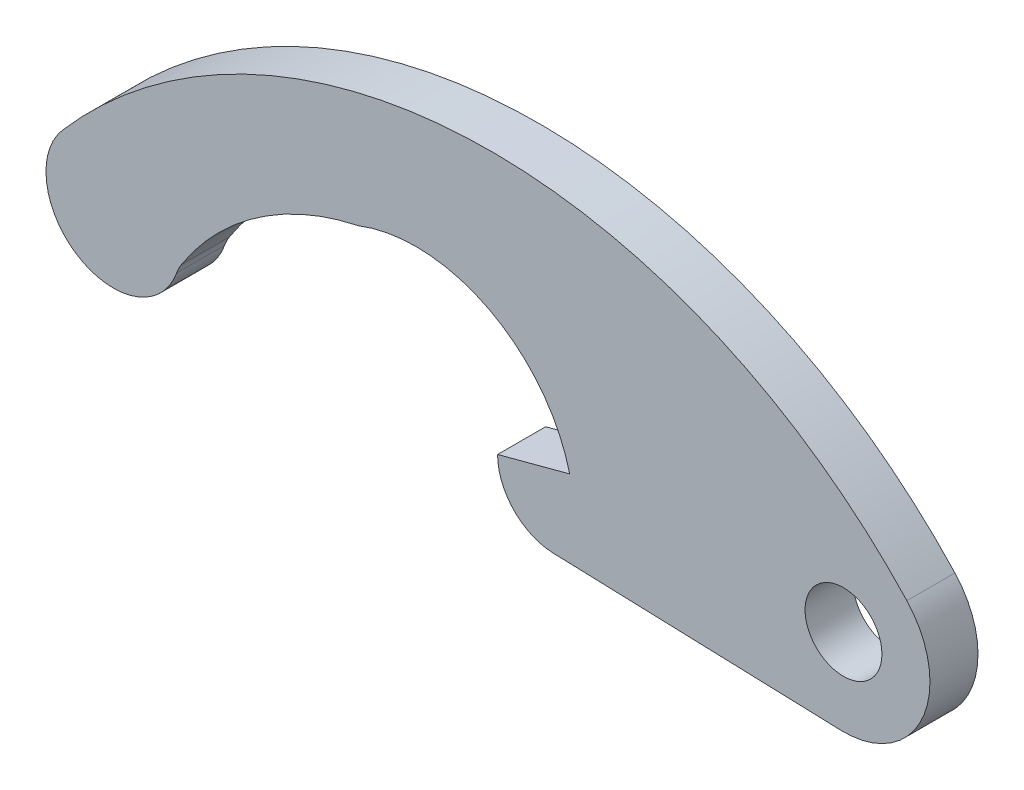
ISO-10303-21;
HEADER;
FILE_DESCRIPTION(('STEP AP214'),'2;1');
FILE_NAME('part.step','',(''),(''),'','','');
FILE_SCHEMA(('AUTOMOTIVE_DESIGN { 1 0 10303 214 1 1 1 1 }'));
ENDSEC;
DATA;
#1=APPLICATION_CONTEXT('core data for automotive mechanical design processes');
#2=APPLICATION_PROTOCOL_DEFINITION('international standard','automotive_design',2000,#1);
#3=PRODUCT_CONTEXT('',#1,'mechanical');
#4=PRODUCT('Part','Part','',(#3));
#5=PRODUCT_RELATED_PRODUCT_CATEGORY('part','',(#4));
#6=PRODUCT_DEFINITION_FORMATION('','',#4);
#7=PRODUCT_DEFINITION_CONTEXT('part definition',#1,'design');
#8=PRODUCT_DEFINITION('design','',#6,#7);
#9=PRODUCT_DEFINITION_SHAPE('','',#8);
#10=(LENGTH_UNIT() NAMED_UNIT(*) SI_UNIT(.MILLI.,.METRE.));
#11=(NAMED_UNIT(*) PLANE_ANGLE_UNIT() SI_UNIT($,.RADIAN.));
#12=(NAMED_UNIT(*) SI_UNIT($,.STERADIAN.) SOLID_ANGLE_UNIT());
#13=UNCERTAINTY_MEASURE_WITH_UNIT(LENGTH_MEASURE(1.E-05),#10,'distance_accuracy_value','');
#14=(GEOMETRIC_REPRESENTATION_CONTEXT(3) GLOBAL_UNCERTAINTY_ASSIGNED_CONTEXT((#13)) GLOBAL_UNIT_ASSIGNED_CONTEXT((#10,
#11,#12)) REPRESENTATION_CONTEXT('',''));
#15=CARTESIAN_POINT('',(0.,0.,0.));
#16=DIRECTION('',(0.,0.,1.));
#17=DIRECTION('',(1.,0.,0.));
#18=AXIS2_PLACEMENT_3D('',#15,#16,#17);
#19=CARTESIAN_POINT('',(-18.034,26.416,2.54));
#20=DIRECTION('',(0.,0.,-1.));
#21=DIRECTION('',(-1.,0.,0.));
#22=AXIS2_PLACEMENT_3D('',#19,#20,#21);
#23=CYLINDRICAL_SURFACE('',#22,3.048);
#24=CARTESIAN_POINT('',(-18.034,26.416,0.));
#25=DIRECTION('',(0.,0.,1.));
#26=DIRECTION('',(1.,0.,0.));
#27=AXIS2_PLACEMENT_3D('',#24,#25,#26);
#28=CIRCLE('',#27,3.048);
#29=CARTESIAN_POINT('',(-21.082,26.416,0.));
#30=VERTEX_POINT('',#29);
#31=CARTESIAN_POINT('',(-18.1357131720379,23.3696975805685,0.));
#32=VERTEX_POINT('',#31);
#33=EDGE_CURVE('E141',#30,#32,#28,.T.);
#34=ORIENTED_EDGE('',*,*,#33,.T.);
#35=DIRECTION('',(0.,0.,-1.));
#36=VECTOR('',#35,1.);
#37=CARTESIAN_POINT('',(-18.1357131720379,23.3696975805685,2.54));
#38=LINE('',#37,#36);
#39=CARTESIAN_POINT('',(-18.1357131720379,23.3696975805685,2.54));
#40=VERTEX_POINT('',#39);
#41=EDGE_CURVE('E11',#40,#32,#38,.T.);
#42=ORIENTED_EDGE('',*,*,#41,.F.);
#43=CARTESIAN_POINT('',(-18.034,26.416,2.54));
#44=DIRECTION('',(0.,0.,1.));
#45=DIRECTION('',(1.,0.,0.));
#46=AXIS2_PLACEMENT_3D('',#43,#44,#45);
#47=CIRCLE('',#46,3.048);
#48=CARTESIAN_POINT('',(-21.082,26.416,2.54));
#49=VERTEX_POINT('',#48);
#50=EDGE_CURVE('E158',#49,#40,#47,.T.);
#51=ORIENTED_EDGE('',*,*,#50,.F.);
#52=DIRECTION('',(0.,0.,-1.));
#53=VECTOR('',#52,1.);
#54=CARTESIAN_POINT('',(-21.082,26.416,2.54));
#55=LINE('',#54,#53);
#56=EDGE_CURVE('E137',#49,#30,#55,.T.);
#57=ORIENTED_EDGE('',*,*,#56,.T.);
#58=EDGE_LOOP('',(#34,#42,#51,#57));
#59=FACE_BOUND('',#58,.T.);
#60=ADVANCED_FACE('F39',(#59),#23,.T.);
#61=CARTESIAN_POINT('',(-18.1357131720379,23.3696975805685,2.54));
#62=DIRECTION('',(0.0333704632670286,0.999443050994575,0.));
#63=DIRECTION('',(-0.999443050994575,0.0333704632670286,0.));
#64=AXIS2_PLACEMENT_3D('',#61,#62,#63);
#65=PLANE('',#64);
#66=DIRECTION('',(0.999443050994575,-0.0333704632670286,0.));
#67=VECTOR('',#66,1.);
#68=CARTESIAN_POINT('',(-18.1357131720379,23.3696975805685,0.));
#69=LINE('',#68,#67);
#70=CARTESIAN_POINT('',(-2.94656975805687,22.8625463708528,0.));
#71=VERTEX_POINT('',#70);
#72=EDGE_CURVE('E144',#32,#71,#69,.T.);
#73=ORIENTED_EDGE('',*,*,#72,.T.);
#74=DIRECTION('',(0.,0.,-1.));
#75=VECTOR('',#74,1.);
#76=CARTESIAN_POINT('',(-2.94656975805687,22.8625463708528,2.54));
#77=LINE('',#76,#75);
#78=CARTESIAN_POINT('',(-2.94656975805687,22.8625463708528,2.54));
#79=VERTEX_POINT('',#78);
#80=EDGE_CURVE('E47',#79,#71,#77,.T.);
#81=ORIENTED_EDGE('',*,*,#80,.F.);
#82=DIRECTION('',(0.999443050994575,-0.0333704632670286,0.));
#83=VECTOR('',#82,1.);
#84=CARTESIAN_POINT('',(-18.1357131720379,23.3696975805685,2.54));
#85=LINE('',#84,#83);
#86=EDGE_CURVE('E101',#40,#79,#85,.T.);
#87=ORIENTED_EDGE('',*,*,#86,.F.);
#88=ORIENTED_EDGE('',*,*,#41,.T.);
#89=EDGE_LOOP('',(#73,#81,#87,#88));
#90=FACE_BOUND('',#89,.T.);
#91=ADVANCED_FACE('F222',(#90),#65,.F.);
#92=CARTESIAN_POINT('',(-2.79400000000001,27.432,2.54));
#93=DIRECTION('',(0.,0.,-1.));
#94=DIRECTION('',(-1.,0.,0.));
#95=AXIS2_PLACEMENT_3D('',#92,#93,#94);
#96=CYLINDRICAL_SURFACE('',#95,4.572);
#97=CARTESIAN_POINT('',(-2.79400000000001,27.432,0.));
#98=DIRECTION('',(0.,0.,1.));
#99=DIRECTION('',(1.,0.,0.));
#100=AXIS2_PLACEMENT_3D('',#97,#98,#99);
#101=CIRCLE('',#100,4.572);
#102=CARTESIAN_POINT('',(0.557997894736831,30.5412272534634,0.));
#103=VERTEX_POINT('',#102);
#104=EDGE_CURVE('E147',#71,#103,#101,.T.);
#105=ORIENTED_EDGE('',*,*,#104,.T.);
#106=DIRECTION('',(0.,0.,-1.));
#107=VECTOR('',#106,1.);
#108=CARTESIAN_POINT('',(0.557997894736831,30.5412272534634,2.54));
#109=LINE('',#108,#107);
#110=CARTESIAN_POINT('',(0.557997894736831,30.5412272534634,2.54));
#111=VERTEX_POINT('',#110);
#112=EDGE_CURVE('E168',#111,#103,#109,.T.);
#113=ORIENTED_EDGE('',*,*,#112,.F.);
#114=CARTESIAN_POINT('',(-2.79400000000001,27.432,2.54));
#115=DIRECTION('',(0.,0.,1.));
#116=DIRECTION('',(1.,0.,0.));
#117=AXIS2_PLACEMENT_3D('',#114,#115,#116);
#118=CIRCLE('',#117,4.572);
#119=EDGE_CURVE('E176',#79,#111,#118,.T.);
#120=ORIENTED_EDGE('',*,*,#119,.F.);
#121=ORIENTED_EDGE('',*,*,#80,.T.);
#122=EDGE_LOOP('',(#105,#113,#120,#121));
#123=FACE_BOUND('',#122,.T.);
#124=ADVANCED_FACE('F174',(#123),#96,.T.);
#125=CARTESIAN_POINT('',(-21.4162105263158,10.1585152585365,2.54));
#126=DIRECTION('',(0.,0.,-1.));
#127=DIRECTION('',(-1.,0.,0.));
#128=AXIS2_PLACEMENT_3D('',#125,#126,#127);
#129=CYLINDRICAL_SURFACE('',#128,29.972);
#130=CARTESIAN_POINT('',(-21.4162105263158,10.1585152585365,0.));
#131=DIRECTION('',(0.,0.,1.));
#132=DIRECTION('',(1.,0.,0.));
#133=AXIS2_PLACEMENT_3D('',#130,#131,#132);
#134=CIRCLE('',#133,29.972);
#135=CARTESIAN_POINT('',(-44.0923947368421,29.7572767921201,0.));
#136=VERTEX_POINT('',#135);
#137=EDGE_CURVE('E149',#103,#136,#134,.T.);
#138=ORIENTED_EDGE('',*,*,#137,.T.);
#139=DIRECTION('',(0.,0.,-1.));
#140=VECTOR('',#139,1.);
#141=CARTESIAN_POINT('',(-44.0923947368421,29.7572767921201,2.54));
#142=LINE('',#141,#140);
#143=CARTESIAN_POINT('',(-44.0923947368421,29.7572767921201,2.54));
#144=VERTEX_POINT('',#143);
#145=EDGE_CURVE('E165',#144,#136,#142,.T.);
#146=ORIENTED_EDGE('',*,*,#145,.F.);
#147=CARTESIAN_POINT('',(-21.4162105263158,10.1585152585365,2.54));
#148=DIRECTION('',(0.,0.,1.));
#149=DIRECTION('',(1.,0.,0.));
#150=AXIS2_PLACEMENT_3D('',#147,#148,#149);
#151=CIRCLE('',#150,29.972);
#152=EDGE_CURVE('E192',#111,#144,#151,.T.);
#153=ORIENTED_EDGE('',*,*,#152,.F.);
#154=ORIENTED_EDGE('',*,*,#112,.T.);
#155=EDGE_LOOP('',(#138,#146,#153,#154));
#156=FACE_BOUND('',#155,.T.);
#157=ADVANCED_FACE('F185',(#156),#129,.T.);
#158=CARTESIAN_POINT('',(-41.402,27.432,2.54));
#159=DIRECTION('',(0.,0.,-1.));
#160=DIRECTION('',(-1.,0.,0.));
#161=AXIS2_PLACEMENT_3D('',#158,#159,#160);
#162=CYLINDRICAL_SURFACE('',#161,3.55600000000001);
#163=CARTESIAN_POINT('',(-41.402,27.432,0.));
#164=DIRECTION('',(0.,0.,1.));
#165=DIRECTION('',(1.,0.,0.));
#166=AXIS2_PLACEMENT_3D('',#163,#164,#165);
#167=CIRCLE('',#166,3.55600000000001);
#168=CARTESIAN_POINT('',(-38.0537918431177,26.2342361926544,0.));
#169=VERTEX_POINT('',#168);
#170=EDGE_CURVE('E151',#136,#169,#167,.T.);
#171=ORIENTED_EDGE('',*,*,#170,.T.);
#172=DIRECTION('',(0.,0.,-1.));
#173=VECTOR('',#172,1.);
#174=CARTESIAN_POINT('',(-38.0537918431177,26.2342361926544,2.54));
#175=LINE('',#174,#173);
#176=CARTESIAN_POINT('',(-38.0537918431177,26.2342361926544,2.54));
#177=VERTEX_POINT('',#176);
#178=EDGE_CURVE('E162',#177,#169,#175,.T.);
#179=ORIENTED_EDGE('',*,*,#178,.F.);
#180=CARTESIAN_POINT('',(-41.402,27.432,2.54));
#181=DIRECTION('',(0.,0.,1.));
#182=DIRECTION('',(1.,0.,0.));
#183=AXIS2_PLACEMENT_3D('',#180,#181,#182);
#184=CIRCLE('',#183,3.55600000000001);
#185=EDGE_CURVE('E191',#144,#177,#184,.T.);
#186=ORIENTED_EDGE('',*,*,#185,.F.);
#187=ORIENTED_EDGE('',*,*,#145,.T.);
#188=EDGE_LOOP('',(#171,#179,#186,#187));
#189=FACE_BOUND('',#188,.T.);
#190=ADVANCED_FACE('F189',(#189),#162,.T.);
#191=CARTESIAN_POINT('',(-35.6622145882018,25.3786906159791,2.54));
#192=DIRECTION('',(0.,0.,-1.));
#193=DIRECTION('',(-1.,0.,0.));
#194=AXIS2_PLACEMENT_3D('',#191,#192,#193);
#195=CYLINDRICAL_SURFACE('',#194,2.54);
#196=CARTESIAN_POINT('',(-35.6622145882018,25.3786906159791,0.));
#197=DIRECTION('',(0.,0.,-1.));
#198=DIRECTION('',(1.,0.,0.));
#199=AXIS2_PLACEMENT_3D('',#196,#197,#198);
#200=CIRCLE('',#199,2.54);
#201=CARTESIAN_POINT('',(-37.8001759607438,26.750084494308,0.));
#202=VERTEX_POINT('',#201);
#203=EDGE_CURVE('E153',#169,#202,#200,.T.);
#204=ORIENTED_EDGE('',*,*,#203,.T.);
#205=DIRECTION('',(0.,0.,-1.));
#206=VECTOR('',#205,1.);
#207=CARTESIAN_POINT('',(-37.8001759607438,26.750084494308,2.54));
#208=LINE('',#207,#206);
#209=CARTESIAN_POINT('',(-37.8001759607438,26.750084494308,2.54));
#210=VERTEX_POINT('',#209);
#211=EDGE_CURVE('E132',#210,#202,#208,.T.);
#212=ORIENTED_EDGE('',*,*,#211,.F.);
#213=CARTESIAN_POINT('',(-35.6622145882018,25.3786906159791,2.54));
#214=DIRECTION('',(0.,0.,-1.));
#215=DIRECTION('',(1.,0.,0.));
#216=AXIS2_PLACEMENT_3D('',#213,#214,#215);
#217=CIRCLE('',#216,2.54);
#218=EDGE_CURVE('E123',#177,#210,#217,.T.);
#219=ORIENTED_EDGE('',*,*,#218,.F.);
#220=ORIENTED_EDGE('',*,*,#178,.T.);
#221=EDGE_LOOP('',(#204,#212,#219,#220));
#222=FACE_BOUND('',#221,.T.);
#223=ADVANCED_FACE('F230',(#222),#195,.F.);
#224=CARTESIAN_POINT('',(-25.4,18.796,2.54));
#225=DIRECTION('',(0.,0.,-1.));
#226=DIRECTION('',(-1.,0.,0.));
#227=AXIS2_PLACEMENT_3D('',#224,#225,#226);
#228=CYLINDRICAL_SURFACE('',#227,14.732);
#229=CARTESIAN_POINT('',(-25.4,18.796,0.));
#230=DIRECTION('',(0.,0.,-1.));
#231=DIRECTION('',(1.,0.,0.));
#232=AXIS2_PLACEMENT_3D('',#229,#230,#231);
#233=CIRCLE('',#232,14.732);
#234=CARTESIAN_POINT('',(-28.4420410500189,33.2105,0.));
#235=VERTEX_POINT('',#234);
#236=EDGE_CURVE('E131',#202,#235,#233,.T.);
#237=ORIENTED_EDGE('',*,*,#236,.T.);
#238=DIRECTION('',(0.,0.,-1.));
#239=VECTOR('',#238,1.);
#240=CARTESIAN_POINT('',(-28.4420410500189,33.2105,2.54));
#241=LINE('',#240,#239);
#242=CARTESIAN_POINT('',(-28.4420410500189,33.2105,2.54));
#243=VERTEX_POINT('',#242);
#244=EDGE_CURVE('E128',#243,#235,#241,.T.);
#245=ORIENTED_EDGE('',*,*,#244,.F.);
#246=CARTESIAN_POINT('',(-25.4,18.796,2.54));
#247=DIRECTION('',(0.,0.,-1.));
#248=DIRECTION('',(1.,0.,0.));
#249=AXIS2_PLACEMENT_3D('',#246,#247,#248);
#250=CIRCLE('',#249,14.732);
#251=EDGE_CURVE('E117',#210,#243,#250,.T.);
#252=ORIENTED_EDGE('',*,*,#251,.F.);
#253=ORIENTED_EDGE('',*,*,#211,.T.);
#254=EDGE_LOOP('',(#237,#245,#252,#253));
#255=FACE_BOUND('',#254,.T.);
#256=ADVANCED_FACE('F129',(#255),#228,.F.);
#257=CARTESIAN_POINT('',(-25.4,25.4,2.54));
#258=DIRECTION('',(0.,0.,-1.));
#259=DIRECTION('',(-1.,0.,0.));
#260=AXIS2_PLACEMENT_3D('',#257,#258,#259);
#261=CYLINDRICAL_SURFACE('',#260,8.382);
#262=CARTESIAN_POINT('',(-25.4,25.4,0.));
#263=DIRECTION('',(0.,0.,-1.));
#264=DIRECTION('',(1.,0.,0.));
#265=AXIS2_PLACEMENT_3D('',#262,#263,#264);
#266=CIRCLE('',#265,8.382);
#267=CARTESIAN_POINT('',(-17.2680322184603,27.432,0.));
#268=VERTEX_POINT('',#267);
#269=EDGE_CURVE('E87',#235,#268,#266,.T.);
#270=ORIENTED_EDGE('',*,*,#269,.T.);
#271=DIRECTION('',(0.,0.,-1.));
#272=VECTOR('',#271,1.);
#273=CARTESIAN_POINT('',(-17.2680322184603,27.432,2.54));
#274=LINE('',#273,#272);
#275=CARTESIAN_POINT('',(-17.2680322184603,27.432,2.54));
#276=VERTEX_POINT('',#275);
#277=EDGE_CURVE('E133',#276,#268,#274,.T.);
#278=ORIENTED_EDGE('',*,*,#277,.F.);
#279=CARTESIAN_POINT('',(-25.4,25.4,2.54));
#280=DIRECTION('',(0.,0.,-1.));
#281=DIRECTION('',(1.,0.,0.));
#282=AXIS2_PLACEMENT_3D('',#279,#280,#281);
#283=CIRCLE('',#282,8.382);
#284=EDGE_CURVE('E121',#243,#276,#283,.T.);
#285=ORIENTED_EDGE('',*,*,#284,.F.);
#286=ORIENTED_EDGE('',*,*,#244,.T.);
#287=EDGE_LOOP('',(#270,#278,#285,#286));
#288=FACE_BOUND('',#287,.T.);
#289=ADVANCED_FACE('F135',(#288),#261,.F.);
#290=CARTESIAN_POINT('',(-17.2680322184603,27.432,2.54));
#291=DIRECTION('',(0.257412366807237,-0.966301647217212,0.));
#292=DIRECTION('',(0.966301647217212,0.257412366807237,0.));
#293=AXIS2_PLACEMENT_3D('',#290,#291,#292);
#294=PLANE('',#293);
#295=DIRECTION('',(-0.966301647217212,-0.257412366807237,0.));
#296=VECTOR('',#295,1.);
#297=CARTESIAN_POINT('',(-17.2680322184603,27.432,0.));
#298=LINE('',#297,#296);
#299=EDGE_CURVE('E93',#268,#30,#298,.T.);
#300=ORIENTED_EDGE('',*,*,#299,.T.);
#301=ORIENTED_EDGE('',*,*,#56,.F.);
#302=DIRECTION('',(-0.966301647217212,-0.257412366807237,0.));
#303=VECTOR('',#302,1.);
#304=CARTESIAN_POINT('',(-17.2680322184603,27.432,2.54));
#305=LINE('',#304,#303);
#306=EDGE_CURVE('E55',#276,#49,#305,.T.);
#307=ORIENTED_EDGE('',*,*,#306,.F.);
#308=ORIENTED_EDGE('',*,*,#277,.T.);
#309=EDGE_LOOP('',(#300,#301,#307,#308));
#310=FACE_BOUND('',#309,.T.);
#311=ADVANCED_FACE('F213',(#310),#294,.F.);
#312=CARTESIAN_POINT('',(-18.034,26.416,2.54));
#313=DIRECTION('',(0.,0.,1.));
#314=DIRECTION('',(1.,0.,0.));
#315=AXIS2_PLACEMENT_3D('',#312,#313,#314);
#316=PLANE('',#315);
#317=CARTESIAN_POINT('',(-2.79400000000001,27.432,2.54));
#318=DIRECTION('',(0.,0.,1.));
#319=DIRECTION('',(1.,0.,0.));
#320=AXIS2_PLACEMENT_3D('',#317,#318,#319);
#321=CIRCLE('',#320,2.032);
#322=CARTESIAN_POINT('',(-0.762000000000012,27.432,2.54));
#323=VERTEX_POINT('',#322);
#324=EDGE_CURVE('E199',#323,#323,#321,.T.);
#325=ORIENTED_EDGE('',*,*,#324,.F.);
#326=EDGE_LOOP('',(#325));
#327=FACE_BOUND('',#326,.T.);
#328=ORIENTED_EDGE('',*,*,#50,.T.);
#329=ORIENTED_EDGE('',*,*,#86,.T.);
#330=ORIENTED_EDGE('',*,*,#119,.T.);
#331=ORIENTED_EDGE('',*,*,#152,.T.);
#332=ORIENTED_EDGE('',*,*,#185,.T.);
#333=ORIENTED_EDGE('',*,*,#218,.T.);
#334=ORIENTED_EDGE('',*,*,#251,.T.);
#335=ORIENTED_EDGE('',*,*,#284,.T.);
#336=ORIENTED_EDGE('',*,*,#306,.T.);
#337=EDGE_LOOP('',(#328,#329,#330,#331,#332,#333,#334,#335,#336));
#338=FACE_BOUND('',#337,.T.);
#339=ADVANCED_FACE('F119',(#327,#338),#316,.T.);
#340=CARTESIAN_POINT('',(-18.034,26.416,0.));
#341=DIRECTION('',(0.,0.,1.));
#342=DIRECTION('',(1.,0.,0.));
#343=AXIS2_PLACEMENT_3D('',#340,#341,#342);
#344=PLANE('',#343);
#345=CARTESIAN_POINT('',(-2.79400000000001,27.432,0.));
#346=DIRECTION('',(0.,0.,1.));
#347=DIRECTION('',(1.,0.,0.));
#348=AXIS2_PLACEMENT_3D('',#345,#346,#347);
#349=CIRCLE('',#348,2.032);
#350=CARTESIAN_POINT('',(-0.762000000000012,27.432,0.));
#351=VERTEX_POINT('',#350);
#352=EDGE_CURVE('E145',#351,#351,#349,.T.);
#353=ORIENTED_EDGE('',*,*,#352,.T.);
#354=EDGE_LOOP('',(#353));
#355=FACE_BOUND('',#354,.T.);
#356=ORIENTED_EDGE('',*,*,#33,.F.);
#357=ORIENTED_EDGE('',*,*,#299,.F.);
#358=ORIENTED_EDGE('',*,*,#269,.F.);
#359=ORIENTED_EDGE('',*,*,#236,.F.);
#360=ORIENTED_EDGE('',*,*,#203,.F.);
#361=ORIENTED_EDGE('',*,*,#170,.F.);
#362=ORIENTED_EDGE('',*,*,#137,.F.);
#363=ORIENTED_EDGE('',*,*,#104,.F.);
#364=ORIENTED_EDGE('',*,*,#72,.F.);
#365=EDGE_LOOP('',(#356,#357,#358,#359,#360,#361,#362,#363,#364));
#366=FACE_BOUND('',#365,.T.);
#367=ADVANCED_FACE('F180',(#355,#366),#344,.F.);
#368=CARTESIAN_POINT('',(-2.79400000000001,27.432,0.));
#369=DIRECTION('',(0.,0.,1.));
#370=DIRECTION('',(1.,0.,0.));
#371=AXIS2_PLACEMENT_3D('',#368,#369,#370);
#372=CYLINDRICAL_SURFACE('',#371,2.032);
#373=ORIENTED_EDGE('',*,*,#352,.F.);
#374=EDGE_LOOP('',(#373));
#375=FACE_BOUND('',#374,.T.);
#376=ORIENTED_EDGE('',*,*,#324,.T.);
#377=EDGE_LOOP('',(#376));
#378=FACE_BOUND('',#377,.T.);
#379=ADVANCED_FACE('F206',(#375,#378),#372,.F.);
#380=CLOSED_SHELL('',(#60,#91,#124,#157,#190,#223,#256,#289,#311,#339,#367,#379));
#381=MANIFOLD_SOLID_BREP('B2',#380);
#382=ADVANCED_BREP_SHAPE_REPRESENTATION('',(#18,#381),#14);
#383=SHAPE_DEFINITION_REPRESENTATION(#9,#382);
ENDSEC;
END-ISO-10303-21;
